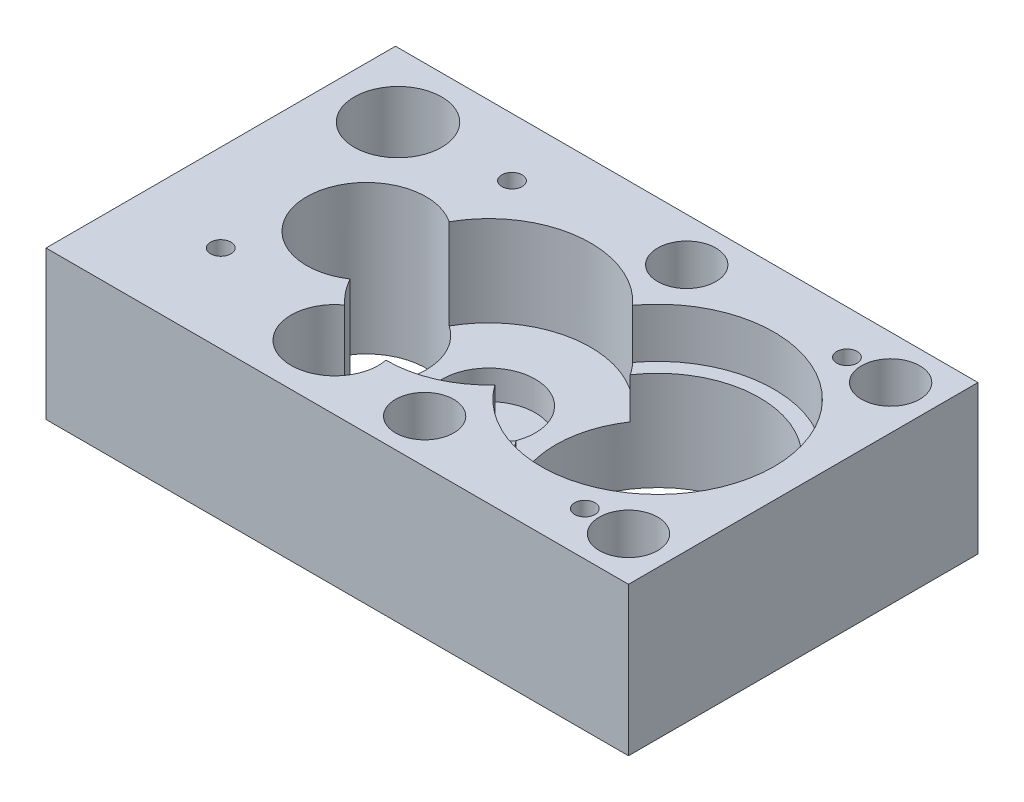
ISO-10303-21;
HEADER;
FILE_DESCRIPTION(('STEP AP214'),'2;1');
FILE_NAME('part.step','',(''),(''),'','','');
FILE_SCHEMA(('AUTOMOTIVE_DESIGN { 1 0 10303 214 1 1 1 1 }'));
ENDSEC;
DATA;
#1=APPLICATION_CONTEXT('core data for automotive mechanical design processes');
#2=APPLICATION_PROTOCOL_DEFINITION('international standard','automotive_design',2000,#1);
#3=PRODUCT_CONTEXT('',#1,'mechanical');
#4=PRODUCT('Part','Part','',(#3));
#5=PRODUCT_RELATED_PRODUCT_CATEGORY('part','',(#4));
#6=PRODUCT_DEFINITION_FORMATION('','',#4);
#7=PRODUCT_DEFINITION_CONTEXT('part definition',#1,'design');
#8=PRODUCT_DEFINITION('design','',#6,#7);
#9=PRODUCT_DEFINITION_SHAPE('','',#8);
#10=(LENGTH_UNIT() NAMED_UNIT(*) SI_UNIT(.MILLI.,.METRE.));
#11=(NAMED_UNIT(*) PLANE_ANGLE_UNIT() SI_UNIT($,.RADIAN.));
#12=(NAMED_UNIT(*) SI_UNIT($,.STERADIAN.) SOLID_ANGLE_UNIT());
#13=UNCERTAINTY_MEASURE_WITH_UNIT(LENGTH_MEASURE(1.E-05),#10,'distance_accuracy_value','');
#14=(GEOMETRIC_REPRESENTATION_CONTEXT(3) GLOBAL_UNCERTAINTY_ASSIGNED_CONTEXT((#13)) GLOBAL_UNIT_ASSIGNED_CONTEXT((#10,
#11,#12)) REPRESENTATION_CONTEXT('',''));
#15=CARTESIAN_POINT('',(0.,0.,0.));
#16=DIRECTION('',(0.,0.,1.));
#17=DIRECTION('',(1.,0.,0.));
#18=AXIS2_PLACEMENT_3D('',#15,#16,#17);
#19=CARTESIAN_POINT('',(11.5,0.,10.5));
#20=DIRECTION('',(0.,1.,0.));
#21=DIRECTION('',(0.,0.,1.));
#22=AXIS2_PLACEMENT_3D('',#19,#20,#21);
#23=CYLINDRICAL_SURFACE('',#22,0.699999999999999);
#24=CARTESIAN_POINT('',(11.5,0.,10.5));
#25=DIRECTION('',(0.,1.,0.));
#26=DIRECTION('',(0.,0.,1.));
#27=AXIS2_PLACEMENT_3D('',#24,#25,#26);
#28=CIRCLE('',#27,0.699999999999999);
#29=CARTESIAN_POINT('',(11.5,0.,11.2));
#30=VERTEX_POINT('',#29);
#31=EDGE_CURVE('E412',#30,#30,#28,.T.);
#32=ORIENTED_EDGE('',*,*,#31,.F.);
#33=EDGE_LOOP('',(#32));
#34=FACE_BOUND('',#33,.T.);
#35=CARTESIAN_POINT('',(11.5,2.,10.5));
#36=DIRECTION('',(0.,1.,0.));
#37=DIRECTION('',(0.,0.,1.));
#38=AXIS2_PLACEMENT_3D('',#35,#36,#37);
#39=CIRCLE('',#38,0.699999999999999);
#40=CARTESIAN_POINT('',(11.5,2.,11.2));
#41=VERTEX_POINT('',#40);
#42=EDGE_CURVE('E183',#41,#41,#39,.F.);
#43=ORIENTED_EDGE('',*,*,#42,.F.);
#44=EDGE_LOOP('',(#43));
#45=FACE_BOUND('',#44,.T.);
#46=ADVANCED_FACE('F179',(#34,#45),#23,.F.);
#47=CARTESIAN_POINT('',(18.5,0.,10.5));
#48=DIRECTION('',(0.,1.,0.));
#49=DIRECTION('',(0.,0.,1.));
#50=AXIS2_PLACEMENT_3D('',#47,#48,#49);
#51=CYLINDRICAL_SURFACE('',#50,0.699999999999998);
#52=CARTESIAN_POINT('',(18.5,0.,10.5));
#53=DIRECTION('',(0.,1.,0.));
#54=DIRECTION('',(0.,0.,1.));
#55=AXIS2_PLACEMENT_3D('',#52,#53,#54);
#56=CIRCLE('',#55,0.699999999999998);
#57=CARTESIAN_POINT('',(18.5,0.,11.2));
#58=VERTEX_POINT('',#57);
#59=EDGE_CURVE('E415',#58,#58,#56,.T.);
#60=ORIENTED_EDGE('',*,*,#59,.F.);
#61=EDGE_LOOP('',(#60));
#62=FACE_BOUND('',#61,.T.);
#63=CARTESIAN_POINT('',(18.5,2.,10.5));
#64=DIRECTION('',(0.,1.,0.));
#65=DIRECTION('',(0.,0.,1.));
#66=AXIS2_PLACEMENT_3D('',#63,#64,#65);
#67=CIRCLE('',#66,0.699999999999998);
#68=CARTESIAN_POINT('',(18.5,2.,11.2));
#69=VERTEX_POINT('',#68);
#70=EDGE_CURVE('E387',#69,#69,#67,.F.);
#71=ORIENTED_EDGE('',*,*,#70,.F.);
#72=EDGE_LOOP('',(#71));
#73=FACE_BOUND('',#72,.T.);
#74=ADVANCED_FACE('F466',(#62,#73),#51,.F.);
#75=CARTESIAN_POINT('',(18.5,0.,1.50000000000001));
#76=DIRECTION('',(0.,1.,0.));
#77=DIRECTION('',(0.,0.,1.));
#78=AXIS2_PLACEMENT_3D('',#75,#76,#77);
#79=CYLINDRICAL_SURFACE('',#78,0.699999999999998);
#80=CARTESIAN_POINT('',(18.5,0.,1.50000000000001));
#81=DIRECTION('',(0.,1.,0.));
#82=DIRECTION('',(0.,0.,1.));
#83=AXIS2_PLACEMENT_3D('',#80,#81,#82);
#84=CIRCLE('',#83,0.699999999999998);
#85=CARTESIAN_POINT('',(18.5,0.,2.20000000000001));
#86=VERTEX_POINT('',#85);
#87=EDGE_CURVE('E418',#86,#86,#84,.T.);
#88=ORIENTED_EDGE('',*,*,#87,.F.);
#89=EDGE_LOOP('',(#88));
#90=FACE_BOUND('',#89,.T.);
#91=CARTESIAN_POINT('',(18.5,2.,1.50000000000001));
#92=DIRECTION('',(0.,1.,0.));
#93=DIRECTION('',(0.,0.,1.));
#94=AXIS2_PLACEMENT_3D('',#91,#92,#93);
#95=CIRCLE('',#94,0.699999999999998);
#96=CARTESIAN_POINT('',(18.5,2.,2.20000000000001));
#97=VERTEX_POINT('',#96);
#98=EDGE_CURVE('E384',#97,#97,#95,.F.);
#99=ORIENTED_EDGE('',*,*,#98,.F.);
#100=EDGE_LOOP('',(#99));
#101=FACE_BOUND('',#100,.T.);
#102=ADVANCED_FACE('F472',(#90,#101),#79,.F.);
#103=CARTESIAN_POINT('',(11.5,0.,1.50000000000001));
#104=DIRECTION('',(0.,1.,0.));
#105=DIRECTION('',(0.,0.,1.));
#106=AXIS2_PLACEMENT_3D('',#103,#104,#105);
#107=CYLINDRICAL_SURFACE('',#106,0.7);
#108=CARTESIAN_POINT('',(11.5,0.,1.50000000000001));
#109=DIRECTION('',(0.,1.,0.));
#110=DIRECTION('',(0.,0.,1.));
#111=AXIS2_PLACEMENT_3D('',#108,#109,#110);
#112=CIRCLE('',#111,0.7);
#113=CARTESIAN_POINT('',(11.5,0.,2.20000000000001));
#114=VERTEX_POINT('',#113);
#115=EDGE_CURVE('E392',#114,#114,#112,.T.);
#116=ORIENTED_EDGE('',*,*,#115,.F.);
#117=EDGE_LOOP('',(#116));
#118=FACE_BOUND('',#117,.T.);
#119=CARTESIAN_POINT('',(11.5,2.,1.50000000000001));
#120=DIRECTION('',(0.,1.,0.));
#121=DIRECTION('',(0.,0.,1.));
#122=AXIS2_PLACEMENT_3D('',#119,#120,#121);
#123=CIRCLE('',#122,0.7);
#124=CARTESIAN_POINT('',(11.5,2.,2.20000000000001));
#125=VERTEX_POINT('',#124);
#126=EDGE_CURVE('E381',#125,#125,#123,.F.);
#127=ORIENTED_EDGE('',*,*,#126,.F.);
#128=EDGE_LOOP('',(#127));
#129=FACE_BOUND('',#128,.T.);
#130=ADVANCED_FACE('F482',(#118,#129),#107,.F.);
#131=CARTESIAN_POINT('',(2.3,0.,2.2141711607628));
#132=DIRECTION('',(0.,1.,0.));
#133=DIRECTION('',(0.,0.,1.));
#134=AXIS2_PLACEMENT_3D('',#131,#132,#133);
#135=CYLINDRICAL_SURFACE('',#134,0.9);
#136=CARTESIAN_POINT('',(2.3,0.,2.2141711607628));
#137=DIRECTION('',(0.,1.,0.));
#138=DIRECTION('',(0.,0.,1.));
#139=AXIS2_PLACEMENT_3D('',#136,#137,#138);
#140=CIRCLE('',#139,0.9);
#141=CARTESIAN_POINT('',(2.3,0.,3.1141711607628));
#142=VERTEX_POINT('',#141);
#143=EDGE_CURVE('E432',#142,#142,#140,.T.);
#144=ORIENTED_EDGE('',*,*,#143,.F.);
#145=EDGE_LOOP('',(#144));
#146=FACE_BOUND('',#145,.T.);
#147=CARTESIAN_POINT('',(2.3,0.5,2.2141711607628));
#148=DIRECTION('',(0.,1.,0.));
#149=DIRECTION('',(0.,0.,1.));
#150=AXIS2_PLACEMENT_3D('',#147,#148,#149);
#151=CIRCLE('',#150,0.9);
#152=CARTESIAN_POINT('',(2.3,0.5,3.1141711607628));
#153=VERTEX_POINT('',#152);
#154=EDGE_CURVE('E289',#153,#153,#151,.F.);
#155=ORIENTED_EDGE('',*,*,#154,.F.);
#156=EDGE_LOOP('',(#155));
#157=FACE_BOUND('',#156,.T.);
#158=ADVANCED_FACE('F498',(#146,#157),#135,.F.);
#159=CARTESIAN_POINT('',(7.7,0.,9.78582883923719));
#160=DIRECTION('',(0.,1.,0.));
#161=DIRECTION('',(0.,0.,1.));
#162=AXIS2_PLACEMENT_3D('',#159,#160,#161);
#163=CYLINDRICAL_SURFACE('',#162,0.9);
#164=CARTESIAN_POINT('',(7.7,0.,9.78582883923719));
#165=DIRECTION('',(0.,1.,0.));
#166=DIRECTION('',(0.,0.,1.));
#167=AXIS2_PLACEMENT_3D('',#164,#165,#166);
#168=CIRCLE('',#167,0.9);
#169=CARTESIAN_POINT('',(7.7,0.,10.6858288392372));
#170=VERTEX_POINT('',#169);
#171=EDGE_CURVE('E433',#170,#170,#168,.T.);
#172=ORIENTED_EDGE('',*,*,#171,.F.);
#173=EDGE_LOOP('',(#172));
#174=FACE_BOUND('',#173,.T.);
#175=CARTESIAN_POINT('',(7.7,0.5,9.78582883923719));
#176=DIRECTION('',(0.,1.,0.));
#177=DIRECTION('',(0.,0.,1.));
#178=AXIS2_PLACEMENT_3D('',#175,#176,#177);
#179=CIRCLE('',#178,0.9);
#180=CARTESIAN_POINT('',(7.7,0.5,10.6858288392372));
#181=VERTEX_POINT('',#180);
#182=EDGE_CURVE('E376',#181,#181,#179,.F.);
#183=ORIENTED_EDGE('',*,*,#182,.F.);
#184=EDGE_LOOP('',(#183));
#185=FACE_BOUND('',#184,.T.);
#186=ADVANCED_FACE('F495',(#174,#185),#163,.F.);
#187=CARTESIAN_POINT('',(9.2,3.4,6.));
#188=DIRECTION('',(0.,-1.,0.));
#189=DIRECTION('',(0.,0.,-1.));
#190=AXIS2_PLACEMENT_3D('',#187,#188,#189);
#191=CYLINDRICAL_SURFACE('',#190,3.5);
#192=DIRECTION('',(0.,1.,0.));
#193=VECTOR('',#192,1.);
#194=CARTESIAN_POINT('',(6.82293742263427,2.8,8.56896350758188));
#195=LINE('',#194,#193);
#196=CARTESIAN_POINT('',(6.82293742263427,2.,8.56896350758188));
#197=VERTEX_POINT('',#196);
#198=CARTESIAN_POINT('',(6.82293742263427,5.1,8.56896350758188));
#199=VERTEX_POINT('',#198);
#200=EDGE_CURVE('E196',#197,#199,#195,.T.);
#201=ORIENTED_EDGE('',*,*,#200,.F.);
#202=CARTESIAN_POINT('',(9.2,2.,6.));
#203=DIRECTION('',(0.,1.,0.));
#204=DIRECTION('',(0.,0.,1.));
#205=AXIS2_PLACEMENT_3D('',#202,#203,#204);
#206=CIRCLE('',#205,3.5);
#207=CARTESIAN_POINT('',(6.14196428571429,2.,7.70247395579288));
#208=VERTEX_POINT('',#207);
#209=EDGE_CURVE('E329',#208,#197,#206,.T.);
#210=ORIENTED_EDGE('',*,*,#209,.F.);
#211=DIRECTION('',(0.,-1.,0.));
#212=VECTOR('',#211,1.);
#213=CARTESIAN_POINT('',(6.14196428571429,2.7,7.70247395579288));
#214=LINE('',#213,#212);
#215=CARTESIAN_POINT('',(6.14196428571429,5.1,7.70247395579288));
#216=VERTEX_POINT('',#215);
#217=EDGE_CURVE('E333',#216,#208,#214,.T.);
#218=ORIENTED_EDGE('',*,*,#217,.F.);
#219=CARTESIAN_POINT('',(9.2,5.1,6.));
#220=DIRECTION('',(0.,1.,0.));
#221=DIRECTION('',(0.,0.,1.));
#222=AXIS2_PLACEMENT_3D('',#219,#220,#221);
#223=CIRCLE('',#222,3.5);
#224=EDGE_CURVE('E296',#216,#199,#223,.T.);
#225=ORIENTED_EDGE('',*,*,#224,.T.);
#226=EDGE_LOOP('',(#201,#210,#218,#225));
#227=FACE_BOUND('',#226,.T.);
#228=ADVANCED_FACE('F497',(#227),#191,.F.);
#229=CARTESIAN_POINT('',(0.,3.4,0.));
#230=DIRECTION('',(0.,1.,0.));
#231=DIRECTION('',(0.,0.,1.));
#232=AXIS2_PLACEMENT_3D('',#229,#230,#231);
#233=PLANE('',#232);
#234=CARTESIAN_POINT('',(9.2,3.4,6.));
#235=DIRECTION('',(0.,1.,0.));
#236=DIRECTION('',(0.,0.,1.));
#237=AXIS2_PLACEMENT_3D('',#234,#235,#236);
#238=CIRCLE('',#237,3.5);
#239=CARTESIAN_POINT('',(11.776724137931,3.4,8.36864786682267));
#240=VERTEX_POINT('',#239);
#241=CARTESIAN_POINT('',(12.1,3.4,7.95959179422655));
#242=VERTEX_POINT('',#241);
#243=EDGE_CURVE('E325',#240,#242,#238,.T.);
#244=ORIENTED_EDGE('',*,*,#243,.F.);
#245=CARTESIAN_POINT('',(15.,3.4,6.));
#246=DIRECTION('',(0.,1.,0.));
#247=DIRECTION('',(0.,0.,1.));
#248=AXIS2_PLACEMENT_3D('',#245,#246,#247);
#249=CIRCLE('',#248,4.);
#250=CARTESIAN_POINT('',(11.776724137931,3.4,3.63135213317734));
#251=VERTEX_POINT('',#250);
#252=EDGE_CURVE('E303',#240,#251,#249,.T.);
#253=ORIENTED_EDGE('',*,*,#252,.T.);
#254=CARTESIAN_POINT('',(12.1,3.4,4.04040820577345));
#255=VERTEX_POINT('',#254);
#256=EDGE_CURVE('E328',#255,#251,#238,.T.);
#257=ORIENTED_EDGE('',*,*,#256,.F.);
#258=CARTESIAN_POINT('',(15.,3.4,6.));
#259=DIRECTION('',(0.,1.,0.));
#260=DIRECTION('',(0.,0.,1.));
#261=AXIS2_PLACEMENT_3D('',#258,#259,#260);
#262=CIRCLE('',#261,3.5);
#263=EDGE_CURVE('E322',#242,#255,#262,.T.);
#264=ORIENTED_EDGE('',*,*,#263,.F.);
#265=EDGE_LOOP('',(#244,#253,#257,#264));
#266=FACE_BOUND('',#265,.T.);
#267=ADVANCED_FACE('F441',(#266),#233,.T.);
#268=CARTESIAN_POINT('',(0.,2.,0.));
#269=DIRECTION('',(0.,1.,0.));
#270=DIRECTION('',(0.,0.,1.));
#271=AXIS2_PLACEMENT_3D('',#268,#269,#270);
#272=PLANE('',#271);
#273=CARTESIAN_POINT('',(7.7,2.,9.78582883923719));
#274=DIRECTION('',(0.,1.,0.));
#275=DIRECTION('',(0.,0.,1.));
#276=AXIS2_PLACEMENT_3D('',#273,#274,#275);
#277=CIRCLE('',#276,1.5);
#278=CARTESIAN_POINT('',(9.17249450861856,2.,9.49989191946607));
#279=VERTEX_POINT('',#278);
#280=EDGE_CURVE('E288',#279,#197,#277,.T.);
#281=ORIENTED_EDGE('',*,*,#280,.F.);
#282=CARTESIAN_POINT('',(12.1,2.,7.95959179422654));
#283=VERTEX_POINT('',#282);
#284=EDGE_CURVE('E287',#279,#283,#206,.T.);
#285=ORIENTED_EDGE('',*,*,#284,.T.);
#286=CARTESIAN_POINT('',(15.,2.,6.));
#287=DIRECTION('',(0.,1.,0.));
#288=DIRECTION('',(0.,0.,1.));
#289=AXIS2_PLACEMENT_3D('',#286,#287,#288);
#290=CIRCLE('',#289,3.5);
#291=CARTESIAN_POINT('',(12.1,2.,4.04040820577345));
#292=VERTEX_POINT('',#291);
#293=EDGE_CURVE('E348',#292,#283,#290,.T.);
#294=ORIENTED_EDGE('',*,*,#293,.F.);
#295=CARTESIAN_POINT('',(6.14196428571429,2.,4.29752604420712));
#296=VERTEX_POINT('',#295);
#297=EDGE_CURVE('E324',#292,#296,#206,.T.);
#298=ORIENTED_EDGE('',*,*,#297,.T.);
#299=CARTESIAN_POINT('',(5.,2.,6.));
#300=DIRECTION('',(0.,1.,0.));
#301=DIRECTION('',(0.,0.,1.));
#302=AXIS2_PLACEMENT_3D('',#299,#300,#301);
#303=CIRCLE('',#302,2.05);
#304=EDGE_CURVE('E354',#208,#296,#303,.T.);
#305=ORIENTED_EDGE('',*,*,#304,.F.);
#306=ORIENTED_EDGE('',*,*,#209,.T.);
#307=EDGE_LOOP('',(#281,#285,#294,#298,#305,#306));
#308=FACE_BOUND('',#307,.T.);
#309=CARTESIAN_POINT('',(9.2,2.,6.));
#310=DIRECTION('',(0.,1.,0.));
#311=DIRECTION('',(0.,0.,1.));
#312=AXIS2_PLACEMENT_3D('',#309,#310,#311);
#313=CIRCLE('',#312,1.6);
#314=CARTESIAN_POINT('',(9.2,2.,7.6));
#315=VERTEX_POINT('',#314);
#316=EDGE_CURVE('E341',#315,#315,#313,.T.);
#317=ORIENTED_EDGE('',*,*,#316,.F.);
#318=EDGE_LOOP('',(#317));
#319=FACE_BOUND('',#318,.T.);
#320=ADVANCED_FACE('F514',(#308,#319),#272,.T.);
#321=CARTESIAN_POINT('',(0.,0.,0.));
#322=DIRECTION('',(0.,1.,0.));
#323=DIRECTION('',(0.,0.,1.));
#324=AXIS2_PLACEMENT_3D('',#321,#322,#323);
#325=PLANE('',#324);
#326=CARTESIAN_POINT('',(3.,0.,9.));
#327=DIRECTION('',(0.,1.,0.));
#328=DIRECTION('',(0.,0.,1.));
#329=AXIS2_PLACEMENT_3D('',#326,#327,#328);
#330=CIRCLE('',#329,0.35);
#331=CARTESIAN_POINT('',(3.,0.,9.35));
#332=VERTEX_POINT('',#331);
#333=EDGE_CURVE('E427',#332,#332,#330,.T.);
#334=ORIENTED_EDGE('',*,*,#333,.T.);
#335=EDGE_LOOP('',(#334));
#336=FACE_BOUND('',#335,.T.);
#337=ORIENTED_EDGE('',*,*,#115,.T.);
#338=EDGE_LOOP('',(#337));
#339=FACE_BOUND('',#338,.T.);
#340=CARTESIAN_POINT('',(17.,0.,1.5));
#341=DIRECTION('',(0.,1.,0.));
#342=DIRECTION('',(0.,0.,1.));
#343=AXIS2_PLACEMENT_3D('',#340,#341,#342);
#344=CIRCLE('',#343,0.350000000000001);
#345=CARTESIAN_POINT('',(17.,0.,1.85));
#346=VERTEX_POINT('',#345);
#347=EDGE_CURVE('E396',#346,#346,#344,.T.);
#348=ORIENTED_EDGE('',*,*,#347,.T.);
#349=EDGE_LOOP('',(#348));
#350=FACE_BOUND('',#349,.T.);
#351=CARTESIAN_POINT('',(17.,0.,10.5));
#352=DIRECTION('',(0.,1.,0.));
#353=DIRECTION('',(0.,0.,1.));
#354=AXIS2_PLACEMENT_3D('',#351,#352,#353);
#355=CIRCLE('',#354,0.350000000000001);
#356=CARTESIAN_POINT('',(17.,0.,10.85));
#357=VERTEX_POINT('',#356);
#358=EDGE_CURVE('E904',#357,#357,#355,.T.);
#359=ORIENTED_EDGE('',*,*,#358,.T.);
#360=EDGE_LOOP('',(#359));
#361=FACE_BOUND('',#360,.T.);
#362=ORIENTED_EDGE('',*,*,#87,.T.);
#363=EDGE_LOOP('',(#362));
#364=FACE_BOUND('',#363,.T.);
#365=ORIENTED_EDGE('',*,*,#59,.T.);
#366=EDGE_LOOP('',(#365));
#367=FACE_BOUND('',#366,.T.);
#368=ORIENTED_EDGE('',*,*,#31,.T.);
#369=EDGE_LOOP('',(#368));
#370=FACE_BOUND('',#369,.T.);
#371=CARTESIAN_POINT('',(6.,0.,2.));
#372=DIRECTION('',(0.,1.,0.));
#373=DIRECTION('',(0.,0.,1.));
#374=AXIS2_PLACEMENT_3D('',#371,#372,#373);
#375=CIRCLE('',#374,0.35);
#376=CARTESIAN_POINT('',(6.,0.,2.35));
#377=VERTEX_POINT('',#376);
#378=EDGE_CURVE('E409',#377,#377,#375,.T.);
#379=ORIENTED_EDGE('',*,*,#378,.T.);
#380=EDGE_LOOP('',(#379));
#381=FACE_BOUND('',#380,.T.);
#382=ORIENTED_EDGE('',*,*,#171,.T.);
#383=EDGE_LOOP('',(#382));
#384=FACE_BOUND('',#383,.T.);
#385=ORIENTED_EDGE('',*,*,#143,.T.);
#386=EDGE_LOOP('',(#385));
#387=FACE_BOUND('',#386,.T.);
#388=DIRECTION('',(0.,0.,1.));
#389=VECTOR('',#388,1.);
#390=CARTESIAN_POINT('',(0.,0.,0.));
#391=LINE('',#390,#389);
#392=CARTESIAN_POINT('',(0.,0.,0.));
#393=VERTEX_POINT('',#392);
#394=CARTESIAN_POINT('',(0.,0.,12.));
#395=VERTEX_POINT('',#394);
#396=EDGE_CURVE('E357',#393,#395,#391,.T.);
#397=ORIENTED_EDGE('',*,*,#396,.F.);
#398=DIRECTION('',(1.,0.,0.));
#399=VECTOR('',#398,1.);
#400=CARTESIAN_POINT('',(0.,0.,0.));
#401=LINE('',#400,#399);
#402=CARTESIAN_POINT('',(20.,0.,0.));
#403=VERTEX_POINT('',#402);
#404=EDGE_CURVE('E368',#393,#403,#401,.T.);
#405=ORIENTED_EDGE('',*,*,#404,.T.);
#406=DIRECTION('',(0.,0.,1.));
#407=VECTOR('',#406,1.);
#408=CARTESIAN_POINT('',(20.,0.,0.));
#409=LINE('',#408,#407);
#410=CARTESIAN_POINT('',(20.,0.,12.));
#411=VERTEX_POINT('',#410);
#412=EDGE_CURVE('E365',#403,#411,#409,.T.);
#413=ORIENTED_EDGE('',*,*,#412,.T.);
#414=DIRECTION('',(1.,0.,0.));
#415=VECTOR('',#414,1.);
#416=CARTESIAN_POINT('',(0.,0.,12.));
#417=LINE('',#416,#415);
#418=EDGE_CURVE('E362',#395,#411,#417,.T.);
#419=ORIENTED_EDGE('',*,*,#418,.F.);
#420=EDGE_LOOP('',(#397,#405,#413,#419));
#421=FACE_BOUND('',#420,.T.);
#422=CARTESIAN_POINT('',(5.,0.,6.));
#423=DIRECTION('',(0.,1.,0.));
#424=DIRECTION('',(0.,0.,1.));
#425=AXIS2_PLACEMENT_3D('',#422,#423,#424);
#426=CIRCLE('',#425,2.05);
#427=CARTESIAN_POINT('',(5.,0.,8.05));
#428=VERTEX_POINT('',#427);
#429=EDGE_CURVE('E351',#428,#428,#426,.T.);
#430=ORIENTED_EDGE('',*,*,#429,.T.);
#431=EDGE_LOOP('',(#430));
#432=FACE_BOUND('',#431,.T.);
#433=CARTESIAN_POINT('',(15.,0.,6.));
#434=DIRECTION('',(0.,1.,0.));
#435=DIRECTION('',(0.,0.,1.));
#436=AXIS2_PLACEMENT_3D('',#433,#434,#435);
#437=CIRCLE('',#436,3.5);
#438=CARTESIAN_POINT('',(15.,0.,9.5));
#439=VERTEX_POINT('',#438);
#440=EDGE_CURVE('E345',#439,#439,#437,.T.);
#441=ORIENTED_EDGE('',*,*,#440,.T.);
#442=EDGE_LOOP('',(#441));
#443=FACE_BOUND('',#442,.T.);
#444=ADVANCED_FACE('F511',(#336,#339,#350,#361,#364,#367,#370,#381,#384,#387,#421,#432,#443),
#325,.F.);
#445=CARTESIAN_POINT('',(0.,2.,0.));
#446=DIRECTION('',(1.,0.,0.));
#447=DIRECTION('',(0.,0.,-1.));
#448=AXIS2_PLACEMENT_3D('',#445,#446,#447);
#449=PLANE('',#448);
#450=ORIENTED_EDGE('',*,*,#396,.T.);
#451=DIRECTION('',(0.,-1.,0.));
#452=VECTOR('',#451,1.);
#453=CARTESIAN_POINT('',(0.,2.,12.));
#454=LINE('',#453,#452);
#455=CARTESIAN_POINT('',(0.,5.1,12.));
#456=VERTEX_POINT('',#455);
#457=EDGE_CURVE('E13',#456,#395,#454,.T.);
#458=ORIENTED_EDGE('',*,*,#457,.F.);
#459=DIRECTION('',(0.,0.,-1.));
#460=VECTOR('',#459,1.);
#461=CARTESIAN_POINT('',(0.,5.1,0.));
#462=LINE('',#461,#460);
#463=CARTESIAN_POINT('',(0.,5.1,0.));
#464=VERTEX_POINT('',#463);
#465=EDGE_CURVE('E313',#456,#464,#462,.T.);
#466=ORIENTED_EDGE('',*,*,#465,.T.);
#467=DIRECTION('',(0.,-1.,0.));
#468=VECTOR('',#467,1.);
#469=CARTESIAN_POINT('',(0.,2.,0.));
#470=LINE('',#469,#468);
#471=EDGE_CURVE('E371',#464,#393,#470,.T.);
#472=ORIENTED_EDGE('',*,*,#471,.T.);
#473=EDGE_LOOP('',(#450,#458,#466,#472));
#474=FACE_BOUND('',#473,.T.);
#475=ADVANCED_FACE('F181',(#474),#449,.F.);
#476=CARTESIAN_POINT('',(0.,2.,12.));
#477=DIRECTION('',(0.,0.,-1.));
#478=DIRECTION('',(-1.,0.,0.));
#479=AXIS2_PLACEMENT_3D('',#476,#477,#478);
#480=PLANE('',#479);
#481=ORIENTED_EDGE('',*,*,#418,.T.);
#482=DIRECTION('',(0.,-1.,0.));
#483=VECTOR('',#482,1.);
#484=CARTESIAN_POINT('',(20.,2.,12.));
#485=LINE('',#484,#483);
#486=CARTESIAN_POINT('',(20.,5.1,12.));
#487=VERTEX_POINT('',#486);
#488=EDGE_CURVE('E188',#487,#411,#485,.T.);
#489=ORIENTED_EDGE('',*,*,#488,.F.);
#490=DIRECTION('',(-1.,0.,0.));
#491=VECTOR('',#490,1.);
#492=CARTESIAN_POINT('',(0.,5.1,12.));
#493=LINE('',#492,#491);
#494=EDGE_CURVE('E316',#487,#456,#493,.T.);
#495=ORIENTED_EDGE('',*,*,#494,.T.);
#496=ORIENTED_EDGE('',*,*,#457,.T.);
#497=EDGE_LOOP('',(#481,#489,#495,#496));
#498=FACE_BOUND('',#497,.T.);
#499=ADVANCED_FACE('F547',(#498),#480,.F.);
#500=CARTESIAN_POINT('',(20.,2.,0.));
#501=DIRECTION('',(1.,0.,0.));
#502=DIRECTION('',(0.,0.,-1.));
#503=AXIS2_PLACEMENT_3D('',#500,#501,#502);
#504=PLANE('',#503);
#505=ORIENTED_EDGE('',*,*,#412,.F.);
#506=DIRECTION('',(0.,-1.,0.));
#507=VECTOR('',#506,1.);
#508=CARTESIAN_POINT('',(20.,2.,0.));
#509=LINE('',#508,#507);
#510=CARTESIAN_POINT('',(20.,5.1,0.));
#511=VERTEX_POINT('',#510);
#512=EDGE_CURVE('E373',#511,#403,#509,.T.);
#513=ORIENTED_EDGE('',*,*,#512,.F.);
#514=DIRECTION('',(0.,0.,-1.));
#515=VECTOR('',#514,1.);
#516=CARTESIAN_POINT('',(20.,5.1,0.));
#517=LINE('',#516,#515);
#518=EDGE_CURVE('E307',#487,#511,#517,.T.);
#519=ORIENTED_EDGE('',*,*,#518,.F.);
#520=ORIENTED_EDGE('',*,*,#488,.T.);
#521=EDGE_LOOP('',(#505,#513,#519,#520));
#522=FACE_BOUND('',#521,.T.);
#523=ADVANCED_FACE('F544',(#522),#504,.T.);
#524=CARTESIAN_POINT('',(0.,2.,0.));
#525=DIRECTION('',(0.,0.,-1.));
#526=DIRECTION('',(-1.,0.,0.));
#527=AXIS2_PLACEMENT_3D('',#524,#525,#526);
#528=PLANE('',#527);
#529=ORIENTED_EDGE('',*,*,#404,.F.);
#530=ORIENTED_EDGE('',*,*,#471,.F.);
#531=DIRECTION('',(-1.,0.,0.));
#532=VECTOR('',#531,1.);
#533=CARTESIAN_POINT('',(0.,5.1,0.));
#534=LINE('',#533,#532);
#535=EDGE_CURVE('E310',#511,#464,#534,.T.);
#536=ORIENTED_EDGE('',*,*,#535,.F.);
#537=ORIENTED_EDGE('',*,*,#512,.T.);
#538=EDGE_LOOP('',(#529,#530,#536,#537));
#539=FACE_BOUND('',#538,.T.);
#540=ADVANCED_FACE('F534',(#539),#528,.T.);
#541=CARTESIAN_POINT('',(5.,2.,6.));
#542=DIRECTION('',(0.,-1.,0.));
#543=DIRECTION('',(0.,0.,-1.));
#544=AXIS2_PLACEMENT_3D('',#541,#542,#543);
#545=CYLINDRICAL_SURFACE('',#544,2.05);
#546=ORIENTED_EDGE('',*,*,#304,.T.);
#547=DIRECTION('',(0.,-1.,0.));
#548=VECTOR('',#547,1.);
#549=CARTESIAN_POINT('',(6.14196428571429,2.7,4.29752604420712));
#550=LINE('',#549,#548);
#551=CARTESIAN_POINT('',(6.14196428571429,5.1,4.29752604420712));
#552=VERTEX_POINT('',#551);
#553=EDGE_CURVE('E327',#296,#552,#550,.F.);
#554=ORIENTED_EDGE('',*,*,#553,.T.);
#555=CARTESIAN_POINT('',(5.,5.1,6.));
#556=DIRECTION('',(0.,1.,0.));
#557=DIRECTION('',(0.,0.,1.));
#558=AXIS2_PLACEMENT_3D('',#555,#556,#557);
#559=CIRCLE('',#558,2.05);
#560=EDGE_CURVE('E299',#552,#216,#559,.T.);
#561=ORIENTED_EDGE('',*,*,#560,.T.);
#562=ORIENTED_EDGE('',*,*,#217,.T.);
#563=EDGE_LOOP('',(#546,#554,#561,#562));
#564=FACE_BOUND('',#563,.T.);
#565=ORIENTED_EDGE('',*,*,#429,.F.);
#566=EDGE_LOOP('',(#565));
#567=FACE_BOUND('',#566,.T.);
#568=ADVANCED_FACE('F525',(#564,#567),#545,.F.);
#569=CARTESIAN_POINT('',(15.,2.,6.));
#570=DIRECTION('',(0.,-1.,0.));
#571=DIRECTION('',(0.,0.,-1.));
#572=AXIS2_PLACEMENT_3D('',#569,#570,#571);
#573=CYLINDRICAL_SURFACE('',#572,3.5);
#574=ORIENTED_EDGE('',*,*,#293,.T.);
#575=DIRECTION('',(0.,-1.,0.));
#576=VECTOR('',#575,1.);
#577=CARTESIAN_POINT('',(12.1,2.7,7.95959179422655));
#578=LINE('',#577,#576);
#579=EDGE_CURVE('E339',#242,#283,#578,.T.);
#580=ORIENTED_EDGE('',*,*,#579,.F.);
#581=ORIENTED_EDGE('',*,*,#263,.T.);
#582=DIRECTION('',(0.,-1.,0.));
#583=VECTOR('',#582,1.);
#584=CARTESIAN_POINT('',(12.1,2.7,4.04040820577345));
#585=LINE('',#584,#583);
#586=EDGE_CURVE('E336',#292,#255,#585,.F.);
#587=ORIENTED_EDGE('',*,*,#586,.F.);
#588=EDGE_LOOP('',(#574,#580,#581,#587));
#589=FACE_BOUND('',#588,.T.);
#590=ORIENTED_EDGE('',*,*,#440,.F.);
#591=EDGE_LOOP('',(#590));
#592=FACE_BOUND('',#591,.T.);
#593=ADVANCED_FACE('F449',(#589,#592),#573,.F.);
#594=CARTESIAN_POINT('',(9.2,1.,6.));
#595=DIRECTION('',(0.,1.,0.));
#596=DIRECTION('',(0.,0.,1.));
#597=AXIS2_PLACEMENT_3D('',#594,#595,#596);
#598=CYLINDRICAL_SURFACE('',#597,1.6);
#599=CARTESIAN_POINT('',(9.2,1.,6.));
#600=DIRECTION('',(0.,1.,0.));
#601=DIRECTION('',(0.,0.,1.));
#602=AXIS2_PLACEMENT_3D('',#599,#600,#601);
#603=CIRCLE('',#602,1.6);
#604=CARTESIAN_POINT('',(9.2,1.,7.6));
#605=VERTEX_POINT('',#604);
#606=EDGE_CURVE('E342',#605,#605,#603,.T.);
#607=ORIENTED_EDGE('',*,*,#606,.F.);
#608=EDGE_LOOP('',(#607));
#609=FACE_BOUND('',#608,.T.);
#610=ORIENTED_EDGE('',*,*,#316,.T.);
#611=EDGE_LOOP('',(#610));
#612=FACE_BOUND('',#611,.T.);
#613=ADVANCED_FACE('F524',(#609,#612),#598,.F.);
#614=CARTESIAN_POINT('',(9.2,1.,6.));
#615=DIRECTION('',(0.,1.,0.));
#616=DIRECTION('',(0.,0.,1.));
#617=AXIS2_PLACEMENT_3D('',#614,#615,#616);
#618=PLANE('',#617);
#619=ORIENTED_EDGE('',*,*,#606,.T.);
#620=EDGE_LOOP('',(#619));
#621=FACE_BOUND('',#620,.T.);
#622=ADVANCED_FACE('F531',(#621),#618,.T.);
#623=DIRECTION('',(0.,1.,0.));
#624=VECTOR('',#623,1.);
#625=CARTESIAN_POINT('',(9.17249450861856,2.8,9.49989191946607));
#626=LINE('',#625,#624);
#627=CARTESIAN_POINT('',(9.17249450861856,5.1,9.49989191946607));
#628=VERTEX_POINT('',#627);
#629=EDGE_CURVE('E271',#628,#279,#626,.F.);
#630=ORIENTED_EDGE('',*,*,#629,.F.);
#631=CARTESIAN_POINT('',(11.776724137931,5.1,8.36864786682267));
#632=VERTEX_POINT('',#631);
#633=EDGE_CURVE('E284',#628,#632,#223,.T.);
#634=ORIENTED_EDGE('',*,*,#633,.T.);
#635=DIRECTION('',(0.,-1.,0.));
#636=VECTOR('',#635,1.);
#637=CARTESIAN_POINT('',(11.776724137931,4.25,8.36864786682267));
#638=LINE('',#637,#636);
#639=EDGE_CURVE('E320',#632,#240,#638,.T.);
#640=ORIENTED_EDGE('',*,*,#639,.T.);
#641=ORIENTED_EDGE('',*,*,#243,.T.);
#642=ORIENTED_EDGE('',*,*,#579,.T.);
#643=ORIENTED_EDGE('',*,*,#284,.F.);
#644=EDGE_LOOP('',(#630,#634,#640,#641,#642,#643));
#645=FACE_BOUND('',#644,.T.);
#646=ADVANCED_FACE('F282',(#645),#191,.F.);
#647=ORIENTED_EDGE('',*,*,#297,.F.);
#648=ORIENTED_EDGE('',*,*,#586,.T.);
#649=ORIENTED_EDGE('',*,*,#256,.T.);
#650=DIRECTION('',(0.,-1.,0.));
#651=VECTOR('',#650,1.);
#652=CARTESIAN_POINT('',(11.776724137931,4.25,3.63135213317734));
#653=LINE('',#652,#651);
#654=CARTESIAN_POINT('',(11.776724137931,5.1,3.63135213317734));
#655=VERTEX_POINT('',#654);
#656=EDGE_CURVE('E204',#251,#655,#653,.F.);
#657=ORIENTED_EDGE('',*,*,#656,.T.);
#658=EDGE_CURVE('E297',#655,#552,#223,.T.);
#659=ORIENTED_EDGE('',*,*,#658,.T.);
#660=ORIENTED_EDGE('',*,*,#553,.F.);
#661=EDGE_LOOP('',(#647,#648,#649,#657,#659,#660));
#662=FACE_BOUND('',#661,.T.);
#663=ADVANCED_FACE('F445',(#662),#191,.F.);
#664=CARTESIAN_POINT('',(0.,5.1,0.));
#665=DIRECTION('',(0.,1.,0.));
#666=DIRECTION('',(0.,0.,1.));
#667=AXIS2_PLACEMENT_3D('',#664,#665,#666);
#668=PLANE('',#667);
#669=CARTESIAN_POINT('',(18.5,5.1,1.50000000000001));
#670=DIRECTION('',(0.,1.,0.));
#671=DIRECTION('',(0.,0.,1.));
#672=AXIS2_PLACEMENT_3D('',#669,#670,#671);
#673=CIRCLE('',#672,1.);
#674=CARTESIAN_POINT('',(18.5,5.1,2.50000000000001));
#675=VERTEX_POINT('',#674);
#676=EDGE_CURVE('E888',#675,#675,#673,.T.);
#677=ORIENTED_EDGE('',*,*,#676,.F.);
#678=EDGE_LOOP('',(#677));
#679=FACE_BOUND('',#678,.T.);
#680=CARTESIAN_POINT('',(18.5,5.1,10.5));
#681=DIRECTION('',(0.,1.,0.));
#682=DIRECTION('',(0.,0.,1.));
#683=AXIS2_PLACEMENT_3D('',#680,#681,#682);
#684=CIRCLE('',#683,1.);
#685=CARTESIAN_POINT('',(18.5,5.1,11.5));
#686=VERTEX_POINT('',#685);
#687=EDGE_CURVE('E882',#686,#686,#684,.T.);
#688=ORIENTED_EDGE('',*,*,#687,.F.);
#689=EDGE_LOOP('',(#688));
#690=FACE_BOUND('',#689,.T.);
#691=CARTESIAN_POINT('',(11.5,5.1,10.5));
#692=DIRECTION('',(0.,1.,0.));
#693=DIRECTION('',(0.,0.,1.));
#694=AXIS2_PLACEMENT_3D('',#691,#692,#693);
#695=CIRCLE('',#694,1.);
#696=CARTESIAN_POINT('',(11.5,5.1,11.5));
#697=VERTEX_POINT('',#696);
#698=EDGE_CURVE('E876',#697,#697,#695,.T.);
#699=ORIENTED_EDGE('',*,*,#698,.F.);
#700=EDGE_LOOP('',(#699));
#701=FACE_BOUND('',#700,.T.);
#702=CARTESIAN_POINT('',(11.5,5.1,1.50000000000001));
#703=DIRECTION('',(0.,1.,0.));
#704=DIRECTION('',(0.,0.,1.));
#705=AXIS2_PLACEMENT_3D('',#702,#703,#704);
#706=CIRCLE('',#705,1.);
#707=CARTESIAN_POINT('',(11.5,5.1,2.50000000000001));
#708=VERTEX_POINT('',#707);
#709=EDGE_CURVE('E878',#708,#708,#706,.T.);
#710=ORIENTED_EDGE('',*,*,#709,.F.);
#711=EDGE_LOOP('',(#710));
#712=FACE_BOUND('',#711,.T.);
#713=CARTESIAN_POINT('',(3.,5.1,9.));
#714=DIRECTION('',(0.,1.,0.));
#715=DIRECTION('',(0.,0.,1.));
#716=AXIS2_PLACEMENT_3D('',#713,#714,#715);
#717=CIRCLE('',#716,0.35);
#718=CARTESIAN_POINT('',(3.,5.1,9.35));
#719=VERTEX_POINT('',#718);
#720=EDGE_CURVE('E408',#719,#719,#717,.T.);
#721=ORIENTED_EDGE('',*,*,#720,.F.);
#722=EDGE_LOOP('',(#721));
#723=FACE_BOUND('',#722,.T.);
#724=CARTESIAN_POINT('',(17.,5.1,1.5));
#725=DIRECTION('',(0.,1.,0.));
#726=DIRECTION('',(0.,0.,1.));
#727=AXIS2_PLACEMENT_3D('',#724,#725,#726);
#728=CIRCLE('',#727,0.350000000000001);
#729=CARTESIAN_POINT('',(17.,5.1,1.85));
#730=VERTEX_POINT('',#729);
#731=EDGE_CURVE('E401',#730,#730,#728,.T.);
#732=ORIENTED_EDGE('',*,*,#731,.F.);
#733=EDGE_LOOP('',(#732));
#734=FACE_BOUND('',#733,.T.);
#735=CARTESIAN_POINT('',(17.,5.1,10.5));
#736=DIRECTION('',(0.,1.,0.));
#737=DIRECTION('',(0.,0.,1.));
#738=AXIS2_PLACEMENT_3D('',#735,#736,#737);
#739=CIRCLE('',#738,0.350000000000001);
#740=CARTESIAN_POINT('',(17.,5.1,10.85));
#741=VERTEX_POINT('',#740);
#742=EDGE_CURVE('E420',#741,#741,#739,.T.);
#743=ORIENTED_EDGE('',*,*,#742,.F.);
#744=EDGE_LOOP('',(#743));
#745=FACE_BOUND('',#744,.T.);
#746=CARTESIAN_POINT('',(6.,5.1,2.));
#747=DIRECTION('',(0.,1.,0.));
#748=DIRECTION('',(0.,0.,1.));
#749=AXIS2_PLACEMENT_3D('',#746,#747,#748);
#750=CIRCLE('',#749,0.35);
#751=CARTESIAN_POINT('',(6.,5.1,2.35));
#752=VERTEX_POINT('',#751);
#753=EDGE_CURVE('E405',#752,#752,#750,.T.);
#754=ORIENTED_EDGE('',*,*,#753,.F.);
#755=EDGE_LOOP('',(#754));
#756=FACE_BOUND('',#755,.T.);
#757=CARTESIAN_POINT('',(7.7,5.1,9.78582883923719));
#758=DIRECTION('',(0.,1.,0.));
#759=DIRECTION('',(0.,0.,1.));
#760=AXIS2_PLACEMENT_3D('',#757,#758,#759);
#761=CIRCLE('',#760,1.5);
#762=EDGE_CURVE('E267',#199,#628,#761,.T.);
#763=ORIENTED_EDGE('',*,*,#762,.F.);
#764=ORIENTED_EDGE('',*,*,#224,.F.);
#765=ORIENTED_EDGE('',*,*,#560,.F.);
#766=ORIENTED_EDGE('',*,*,#658,.F.);
#767=CARTESIAN_POINT('',(15.,5.1,6.));
#768=DIRECTION('',(0.,1.,0.));
#769=DIRECTION('',(0.,0.,1.));
#770=AXIS2_PLACEMENT_3D('',#767,#768,#769);
#771=CIRCLE('',#770,4.);
#772=EDGE_CURVE('E295',#632,#655,#771,.T.);
#773=ORIENTED_EDGE('',*,*,#772,.F.);
#774=ORIENTED_EDGE('',*,*,#633,.F.);
#775=EDGE_LOOP('',(#763,#764,#765,#766,#773,#774));
#776=FACE_BOUND('',#775,.T.);
#777=CARTESIAN_POINT('',(2.3,5.1,2.2141711607628));
#778=DIRECTION('',(0.,1.,0.));
#779=DIRECTION('',(0.,0.,1.));
#780=AXIS2_PLACEMENT_3D('',#777,#778,#779);
#781=CIRCLE('',#780,1.5);
#782=CARTESIAN_POINT('',(2.3,5.1,3.7141711607628));
#783=VERTEX_POINT('',#782);
#784=EDGE_CURVE('E278',#783,#783,#781,.T.);
#785=ORIENTED_EDGE('',*,*,#784,.F.);
#786=EDGE_LOOP('',(#785));
#787=FACE_BOUND('',#786,.T.);
#788=ORIENTED_EDGE('',*,*,#518,.T.);
#789=ORIENTED_EDGE('',*,*,#535,.T.);
#790=ORIENTED_EDGE('',*,*,#465,.F.);
#791=ORIENTED_EDGE('',*,*,#494,.F.);
#792=EDGE_LOOP('',(#788,#789,#790,#791));
#793=FACE_BOUND('',#792,.T.);
#794=ADVANCED_FACE('F292',(#679,#690,#701,#712,#723,#734,#745,#756,#776,#787,#793),#668,.T.);
#795=CARTESIAN_POINT('',(15.,5.1,6.));
#796=DIRECTION('',(0.,-1.,0.));
#797=DIRECTION('',(0.,0.,-1.));
#798=AXIS2_PLACEMENT_3D('',#795,#796,#797);
#799=CYLINDRICAL_SURFACE('',#798,4.);
#800=ORIENTED_EDGE('',*,*,#772,.T.);
#801=ORIENTED_EDGE('',*,*,#656,.F.);
#802=ORIENTED_EDGE('',*,*,#252,.F.);
#803=ORIENTED_EDGE('',*,*,#639,.F.);
#804=EDGE_LOOP('',(#800,#801,#802,#803));
#805=FACE_BOUND('',#804,.T.);
#806=ADVANCED_FACE('F452',(#805),#799,.F.);
#807=CARTESIAN_POINT('',(0.,0.5,0.));
#808=DIRECTION('',(0.,1.,0.));
#809=DIRECTION('',(0.,0.,1.));
#810=AXIS2_PLACEMENT_3D('',#807,#808,#809);
#811=PLANE('',#810);
#812=CARTESIAN_POINT('',(7.7,0.5,9.78582883923719));
#813=DIRECTION('',(0.,1.,0.));
#814=DIRECTION('',(0.,0.,1.));
#815=AXIS2_PLACEMENT_3D('',#812,#813,#814);
#816=CIRCLE('',#815,1.5);
#817=CARTESIAN_POINT('',(7.7,0.5,11.2858288392372));
#818=VERTEX_POINT('',#817);
#819=EDGE_CURVE('E277',#818,#818,#816,.F.);
#820=ORIENTED_EDGE('',*,*,#819,.F.);
#821=EDGE_LOOP('',(#820));
#822=FACE_BOUND('',#821,.T.);
#823=ORIENTED_EDGE('',*,*,#182,.T.);
#824=EDGE_LOOP('',(#823));
#825=FACE_BOUND('',#824,.T.);
#826=ADVANCED_FACE('F454',(#822,#825),#811,.T.);
#827=CARTESIAN_POINT('',(7.7,-4.24264068711929,9.78582883923719));
#828=DIRECTION('',(0.,1.,0.));
#829=DIRECTION('',(0.,0.,1.));
#830=AXIS2_PLACEMENT_3D('',#827,#828,#829);
#831=CYLINDRICAL_SURFACE('',#830,1.5);
#832=ORIENTED_EDGE('',*,*,#200,.T.);
#833=ORIENTED_EDGE('',*,*,#762,.T.);
#834=ORIENTED_EDGE('',*,*,#629,.T.);
#835=ORIENTED_EDGE('',*,*,#280,.T.);
#836=EDGE_LOOP('',(#832,#833,#834,#835));
#837=FACE_BOUND('',#836,.T.);
#838=ORIENTED_EDGE('',*,*,#819,.T.);
#839=EDGE_LOOP('',(#838));
#840=FACE_BOUND('',#839,.T.);
#841=ADVANCED_FACE('F269',(#837,#840),#831,.F.);
#842=CARTESIAN_POINT('',(0.,0.5,0.));
#843=DIRECTION('',(0.,1.,0.));
#844=DIRECTION('',(0.,0.,1.));
#845=AXIS2_PLACEMENT_3D('',#842,#843,#844);
#846=PLANE('',#845);
#847=CARTESIAN_POINT('',(2.3,0.5,2.2141711607628));
#848=DIRECTION('',(0.,1.,0.));
#849=DIRECTION('',(0.,0.,1.));
#850=AXIS2_PLACEMENT_3D('',#847,#848,#849);
#851=CIRCLE('',#850,1.5);
#852=CARTESIAN_POINT('',(2.3,0.5,3.7141711607628));
#853=VERTEX_POINT('',#852);
#854=EDGE_CURVE('E424',#853,#853,#851,.F.);
#855=ORIENTED_EDGE('',*,*,#854,.F.);
#856=EDGE_LOOP('',(#855));
#857=FACE_BOUND('',#856,.T.);
#858=ORIENTED_EDGE('',*,*,#154,.T.);
#859=EDGE_LOOP('',(#858));
#860=FACE_BOUND('',#859,.T.);
#861=ADVANCED_FACE('F487',(#857,#860),#846,.T.);
#862=CARTESIAN_POINT('',(2.3,-4.24264068711929,2.2141711607628));
#863=DIRECTION('',(0.,1.,0.));
#864=DIRECTION('',(0.,0.,1.));
#865=AXIS2_PLACEMENT_3D('',#862,#863,#864);
#866=CYLINDRICAL_SURFACE('',#865,1.5);
#867=ORIENTED_EDGE('',*,*,#854,.T.);
#868=EDGE_LOOP('',(#867));
#869=FACE_BOUND('',#868,.T.);
#870=ORIENTED_EDGE('',*,*,#784,.T.);
#871=EDGE_LOOP('',(#870));
#872=FACE_BOUND('',#871,.T.);
#873=ADVANCED_FACE('F488',(#869,#872),#866,.F.);
#874=CARTESIAN_POINT('',(6.,0.,2.));
#875=DIRECTION('',(0.,1.,0.));
#876=DIRECTION('',(0.,0.,1.));
#877=AXIS2_PLACEMENT_3D('',#874,#875,#876);
#878=CYLINDRICAL_SURFACE('',#877,0.35);
#879=ORIENTED_EDGE('',*,*,#378,.F.);
#880=EDGE_LOOP('',(#879));
#881=FACE_BOUND('',#880,.T.);
#882=ORIENTED_EDGE('',*,*,#753,.T.);
#883=EDGE_LOOP('',(#882));
#884=FACE_BOUND('',#883,.T.);
#885=ADVANCED_FACE('F478',(#881,#884),#878,.F.);
#886=CARTESIAN_POINT('',(17.,0.,10.5));
#887=DIRECTION('',(0.,1.,0.));
#888=DIRECTION('',(0.,0.,1.));
#889=AXIS2_PLACEMENT_3D('',#886,#887,#888);
#890=CYLINDRICAL_SURFACE('',#889,0.350000000000001);
#891=ORIENTED_EDGE('',*,*,#358,.F.);
#892=EDGE_LOOP('',(#891));
#893=FACE_BOUND('',#892,.T.);
#894=ORIENTED_EDGE('',*,*,#742,.T.);
#895=EDGE_LOOP('',(#894));
#896=FACE_BOUND('',#895,.T.);
#897=ADVANCED_FACE('F730',(#893,#896),#890,.F.);
#898=CARTESIAN_POINT('',(17.,0.,1.5));
#899=DIRECTION('',(0.,1.,0.));
#900=DIRECTION('',(0.,0.,1.));
#901=AXIS2_PLACEMENT_3D('',#898,#899,#900);
#902=CYLINDRICAL_SURFACE('',#901,0.350000000000001);
#903=ORIENTED_EDGE('',*,*,#347,.F.);
#904=EDGE_LOOP('',(#903));
#905=FACE_BOUND('',#904,.T.);
#906=ORIENTED_EDGE('',*,*,#731,.T.);
#907=EDGE_LOOP('',(#906));
#908=FACE_BOUND('',#907,.T.);
#909=ADVANCED_FACE('F736',(#905,#908),#902,.F.);
#910=CARTESIAN_POINT('',(3.,0.,9.));
#911=DIRECTION('',(0.,1.,0.));
#912=DIRECTION('',(0.,0.,1.));
#913=AXIS2_PLACEMENT_3D('',#910,#911,#912);
#914=CYLINDRICAL_SURFACE('',#913,0.35);
#915=ORIENTED_EDGE('',*,*,#333,.F.);
#916=EDGE_LOOP('',(#915));
#917=FACE_BOUND('',#916,.T.);
#918=ORIENTED_EDGE('',*,*,#720,.T.);
#919=EDGE_LOOP('',(#918));
#920=FACE_BOUND('',#919,.T.);
#921=ADVANCED_FACE('F744',(#917,#920),#914,.F.);
#922=CARTESIAN_POINT('',(0.,2.,0.));
#923=DIRECTION('',(0.,1.,0.));
#924=DIRECTION('',(0.,0.,1.));
#925=AXIS2_PLACEMENT_3D('',#922,#923,#924);
#926=PLANE('',#925);
#927=CARTESIAN_POINT('',(11.5,2.,1.50000000000001));
#928=DIRECTION('',(0.,1.,0.));
#929=DIRECTION('',(0.,0.,1.));
#930=AXIS2_PLACEMENT_3D('',#927,#928,#929);
#931=CIRCLE('',#930,1.);
#932=CARTESIAN_POINT('',(11.5,2.,2.50000000000001));
#933=VERTEX_POINT('',#932);
#934=EDGE_CURVE('E385',#933,#933,#931,.F.);
#935=ORIENTED_EDGE('',*,*,#934,.F.);
#936=EDGE_LOOP('',(#935));
#937=FACE_BOUND('',#936,.T.);
#938=ORIENTED_EDGE('',*,*,#126,.T.);
#939=EDGE_LOOP('',(#938));
#940=FACE_BOUND('',#939,.T.);
#941=ADVANCED_FACE('F752',(#937,#940),#926,.T.);
#942=CARTESIAN_POINT('',(11.5,-2.8284271247462,1.50000000000001));
#943=DIRECTION('',(0.,1.,0.));
#944=DIRECTION('',(0.,0.,1.));
#945=AXIS2_PLACEMENT_3D('',#942,#943,#944);
#946=CYLINDRICAL_SURFACE('',#945,1.);
#947=ORIENTED_EDGE('',*,*,#934,.T.);
#948=EDGE_LOOP('',(#947));
#949=FACE_BOUND('',#948,.T.);
#950=ORIENTED_EDGE('',*,*,#709,.T.);
#951=EDGE_LOOP('',(#950));
#952=FACE_BOUND('',#951,.T.);
#953=ADVANCED_FACE('F760',(#949,#952),#946,.F.);
#954=CARTESIAN_POINT('',(0.,2.,0.));
#955=DIRECTION('',(0.,1.,0.));
#956=DIRECTION('',(0.,0.,1.));
#957=AXIS2_PLACEMENT_3D('',#954,#955,#956);
#958=PLANE('',#957);
#959=CARTESIAN_POINT('',(18.5,2.,1.50000000000001));
#960=DIRECTION('',(0.,1.,0.));
#961=DIRECTION('',(0.,0.,1.));
#962=AXIS2_PLACEMENT_3D('',#959,#960,#961);
#963=CIRCLE('',#962,1.);
#964=CARTESIAN_POINT('',(18.5,2.,2.50000000000001));
#965=VERTEX_POINT('',#964);
#966=EDGE_CURVE('E891',#965,#965,#963,.F.);
#967=ORIENTED_EDGE('',*,*,#966,.F.);
#968=EDGE_LOOP('',(#967));
#969=FACE_BOUND('',#968,.T.);
#970=ORIENTED_EDGE('',*,*,#98,.T.);
#971=EDGE_LOOP('',(#970));
#972=FACE_BOUND('',#971,.T.);
#973=ADVANCED_FACE('F769',(#969,#972),#958,.T.);
#974=CARTESIAN_POINT('',(18.5,-2.8284271247462,1.50000000000001));
#975=DIRECTION('',(0.,1.,0.));
#976=DIRECTION('',(0.,0.,1.));
#977=AXIS2_PLACEMENT_3D('',#974,#975,#976);
#978=CYLINDRICAL_SURFACE('',#977,1.);
#979=ORIENTED_EDGE('',*,*,#966,.T.);
#980=EDGE_LOOP('',(#979));
#981=FACE_BOUND('',#980,.T.);
#982=ORIENTED_EDGE('',*,*,#676,.T.);
#983=EDGE_LOOP('',(#982));
#984=FACE_BOUND('',#983,.T.);
#985=ADVANCED_FACE('F777',(#981,#984),#978,.F.);
#986=CARTESIAN_POINT('',(0.,2.,0.));
#987=DIRECTION('',(0.,1.,0.));
#988=DIRECTION('',(0.,0.,1.));
#989=AXIS2_PLACEMENT_3D('',#986,#987,#988);
#990=PLANE('',#989);
#991=CARTESIAN_POINT('',(18.5,2.,10.5));
#992=DIRECTION('',(0.,1.,0.));
#993=DIRECTION('',(0.,0.,1.));
#994=AXIS2_PLACEMENT_3D('',#991,#992,#993);
#995=CIRCLE('',#994,1.);
#996=CARTESIAN_POINT('',(18.5,2.,11.5));
#997=VERTEX_POINT('',#996);
#998=EDGE_CURVE('E885',#997,#997,#995,.F.);
#999=ORIENTED_EDGE('',*,*,#998,.F.);
#1000=EDGE_LOOP('',(#999));
#1001=FACE_BOUND('',#1000,.T.);
#1002=ORIENTED_EDGE('',*,*,#70,.T.);
#1003=EDGE_LOOP('',(#1002));
#1004=FACE_BOUND('',#1003,.T.);
#1005=ADVANCED_FACE('F785',(#1001,#1004),#990,.T.);
#1006=CARTESIAN_POINT('',(18.5,-2.8284271247462,10.5));
#1007=DIRECTION('',(0.,1.,0.));
#1008=DIRECTION('',(0.,0.,1.));
#1009=AXIS2_PLACEMENT_3D('',#1006,#1007,#1008);
#1010=CYLINDRICAL_SURFACE('',#1009,1.);
#1011=ORIENTED_EDGE('',*,*,#998,.T.);
#1012=EDGE_LOOP('',(#1011));
#1013=FACE_BOUND('',#1012,.T.);
#1014=ORIENTED_EDGE('',*,*,#687,.T.);
#1015=EDGE_LOOP('',(#1014));
#1016=FACE_BOUND('',#1015,.T.);
#1017=ADVANCED_FACE('F793',(#1013,#1016),#1010,.F.);
#1018=CARTESIAN_POINT('',(0.,2.,0.));
#1019=DIRECTION('',(0.,1.,0.));
#1020=DIRECTION('',(0.,0.,1.));
#1021=AXIS2_PLACEMENT_3D('',#1018,#1019,#1020);
#1022=PLANE('',#1021);
#1023=CARTESIAN_POINT('',(11.5,2.,10.5));
#1024=DIRECTION('',(0.,1.,0.));
#1025=DIRECTION('',(0.,0.,1.));
#1026=AXIS2_PLACEMENT_3D('',#1023,#1024,#1025);
#1027=CIRCLE('',#1026,1.);
#1028=CARTESIAN_POINT('',(11.5,2.,11.5));
#1029=VERTEX_POINT('',#1028);
#1030=EDGE_CURVE('E873',#1029,#1029,#1027,.F.);
#1031=ORIENTED_EDGE('',*,*,#1030,.F.);
#1032=EDGE_LOOP('',(#1031));
#1033=FACE_BOUND('',#1032,.T.);
#1034=ORIENTED_EDGE('',*,*,#42,.T.);
#1035=EDGE_LOOP('',(#1034));
#1036=FACE_BOUND('',#1035,.T.);
#1037=ADVANCED_FACE('F801',(#1033,#1036),#1022,.T.);
#1038=CARTESIAN_POINT('',(11.5,-2.8284271247462,10.5));
#1039=DIRECTION('',(0.,1.,0.));
#1040=DIRECTION('',(0.,0.,1.));
#1041=AXIS2_PLACEMENT_3D('',#1038,#1039,#1040);
#1042=CYLINDRICAL_SURFACE('',#1041,1.);
#1043=ORIENTED_EDGE('',*,*,#1030,.T.);
#1044=EDGE_LOOP('',(#1043));
#1045=FACE_BOUND('',#1044,.T.);
#1046=ORIENTED_EDGE('',*,*,#698,.T.);
#1047=EDGE_LOOP('',(#1046));
#1048=FACE_BOUND('',#1047,.T.);
#1049=ADVANCED_FACE('F809',(#1045,#1048),#1042,.F.);
#1050=CLOSED_SHELL('',(#46,#74,#102,#130,#158,#186,#228,#267,#320,#444,#475,#499,#523,#540,#568,
#593,#613,#622,#646,#663,#794,#806,#826,#841,#861,#873,#885,#897,#909,#921,#941,#953,#973,#985,
#1005,#1017,#1037,#1049));
#1051=MANIFOLD_SOLID_BREP('B2',#1050);
#1052=ADVANCED_BREP_SHAPE_REPRESENTATION('',(#18,#1051),#14);
#1053=SHAPE_DEFINITION_REPRESENTATION(#9,#1052);
ENDSEC;
END-ISO-10303-21;
